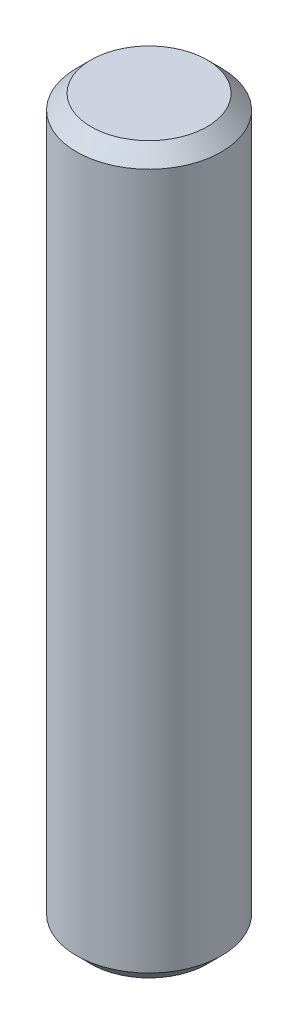
ISO-10303-21;
HEADER;
FILE_DESCRIPTION(('STEP AP214'),'2;1');
FILE_NAME('part.step','',(''),(''),'','','');
FILE_SCHEMA(('AUTOMOTIVE_DESIGN { 1 0 10303 214 1 1 1 1 }'));
ENDSEC;
DATA;
#1=APPLICATION_CONTEXT('core data for automotive mechanical design processes');
#2=APPLICATION_PROTOCOL_DEFINITION('international standard','automotive_design',2000,#1);
#3=PRODUCT_CONTEXT('',#1,'mechanical');
#4=PRODUCT('Part','Part','',(#3));
#5=PRODUCT_RELATED_PRODUCT_CATEGORY('part','',(#4));
#6=PRODUCT_DEFINITION_FORMATION('','',#4);
#7=PRODUCT_DEFINITION_CONTEXT('part definition',#1,'design');
#8=PRODUCT_DEFINITION('design','',#6,#7);
#9=PRODUCT_DEFINITION_SHAPE('','',#8);
#10=(LENGTH_UNIT() NAMED_UNIT(*) SI_UNIT(.MILLI.,.METRE.));
#11=(NAMED_UNIT(*) PLANE_ANGLE_UNIT() SI_UNIT($,.RADIAN.));
#12=(NAMED_UNIT(*) SI_UNIT($,.STERADIAN.) SOLID_ANGLE_UNIT());
#13=UNCERTAINTY_MEASURE_WITH_UNIT(LENGTH_MEASURE(1.E-05),#10,'distance_accuracy_value','');
#14=(GEOMETRIC_REPRESENTATION_CONTEXT(3) GLOBAL_UNCERTAINTY_ASSIGNED_CONTEXT((#13)) GLOBAL_UNIT_ASSIGNED_CONTEXT((#10,
#11,#12)) REPRESENTATION_CONTEXT('',''));
#15=CARTESIAN_POINT('',(0.,0.,0.));
#16=DIRECTION('',(0.,0.,1.));
#17=DIRECTION('',(1.,0.,0.));
#18=AXIS2_PLACEMENT_3D('',#15,#16,#17);
#19=CARTESIAN_POINT('',(0.,-20.,0.));
#20=DIRECTION('',(0.,1.,0.));
#21=DIRECTION('',(0.,0.,1.));
#22=AXIS2_PLACEMENT_3D('',#19,#20,#21);
#23=CONICAL_SURFACE('',#22,1.60000000000001,0.785398163397438);
#24=CARTESIAN_POINT('',(0.,-19.6,0.));
#25=DIRECTION('',(0.,-1.,0.));
#26=DIRECTION('',(0.,0.,-1.));
#27=AXIS2_PLACEMENT_3D('',#24,#25,#26);
#28=CIRCLE('',#27,2.);
#29=CARTESIAN_POINT('',(0.,-19.6,-2.));
#30=VERTEX_POINT('',#29);
#31=EDGE_CURVE('E44',#30,#30,#28,.T.);
#32=ORIENTED_EDGE('',*,*,#31,.T.);
#33=EDGE_LOOP('',(#32));
#34=FACE_BOUND('',#33,.T.);
#35=CARTESIAN_POINT('',(0.,-20.,0.));
#36=DIRECTION('',(0.,-1.,0.));
#37=DIRECTION('',(0.,0.,-1.));
#38=AXIS2_PLACEMENT_3D('',#35,#36,#37);
#39=CIRCLE('',#38,1.60000000000001);
#40=CARTESIAN_POINT('',(0.,-20.,-1.60000000000001));
#41=VERTEX_POINT('',#40);
#42=EDGE_CURVE('E10',#41,#41,#39,.T.);
#43=ORIENTED_EDGE('',*,*,#42,.F.);
#44=EDGE_LOOP('',(#43));
#45=FACE_BOUND('',#44,.T.);
#46=ADVANCED_FACE('F30',(#34,#45),#23,.T.);
#47=CARTESIAN_POINT('',(0.,-20.,0.));
#48=DIRECTION('',(0.,-1.,0.));
#49=DIRECTION('',(0.,0.,-1.));
#50=AXIS2_PLACEMENT_3D('',#47,#48,#49);
#51=PLANE('',#50);
#52=ORIENTED_EDGE('',*,*,#42,.T.);
#53=EDGE_LOOP('',(#52));
#54=FACE_BOUND('',#53,.T.);
#55=ADVANCED_FACE('F63',(#54),#51,.T.);
#56=CARTESIAN_POINT('',(0.,0.,0.));
#57=DIRECTION('',(0.,1.,0.));
#58=DIRECTION('',(0.,0.,1.));
#59=AXIS2_PLACEMENT_3D('',#56,#57,#58);
#60=PLANE('',#59);
#61=CARTESIAN_POINT('',(0.,0.,0.));
#62=DIRECTION('',(0.,-1.,0.));
#63=DIRECTION('',(0.,0.,-1.));
#64=AXIS2_PLACEMENT_3D('',#61,#62,#63);
#65=CIRCLE('',#64,1.60000000000001);
#66=CARTESIAN_POINT('',(0.,0.,-1.60000000000001));
#67=VERTEX_POINT('',#66);
#68=EDGE_CURVE('E36',#67,#67,#65,.T.);
#69=ORIENTED_EDGE('',*,*,#68,.F.);
#70=EDGE_LOOP('',(#69));
#71=FACE_BOUND('',#70,.T.);
#72=ADVANCED_FACE('F60',(#71),#60,.T.);
#73=CARTESIAN_POINT('',(0.,-0.399999999999994,0.));
#74=DIRECTION('',(0.,-1.,0.));
#75=DIRECTION('',(0.,0.,-1.));
#76=AXIS2_PLACEMENT_3D('',#73,#74,#75);
#77=CONICAL_SURFACE('',#76,2.00000000000001,0.78539816339745);
#78=ORIENTED_EDGE('',*,*,#68,.T.);
#79=EDGE_LOOP('',(#78));
#80=FACE_BOUND('',#79,.T.);
#81=CARTESIAN_POINT('',(0.,-0.399999999999994,0.));
#82=DIRECTION('',(0.,-1.,0.));
#83=DIRECTION('',(0.,0.,-1.));
#84=AXIS2_PLACEMENT_3D('',#81,#82,#83);
#85=CIRCLE('',#84,2.00000000000001);
#86=CARTESIAN_POINT('',(0.,-0.399999999999994,-2.00000000000001));
#87=VERTEX_POINT('',#86);
#88=EDGE_CURVE('E40',#87,#87,#85,.T.);
#89=ORIENTED_EDGE('',*,*,#88,.F.);
#90=EDGE_LOOP('',(#89));
#91=FACE_BOUND('',#90,.T.);
#92=ADVANCED_FACE('F54',(#80,#91),#77,.T.);
#93=CARTESIAN_POINT('',(0.,0.,0.));
#94=DIRECTION('',(0.,-1.,0.));
#95=DIRECTION('',(0.,0.,-1.));
#96=AXIS2_PLACEMENT_3D('',#93,#94,#95);
#97=CYLINDRICAL_SURFACE('',#96,2.);
#98=ORIENTED_EDGE('',*,*,#88,.T.);
#99=EDGE_LOOP('',(#98));
#100=FACE_BOUND('',#99,.T.);
#101=ORIENTED_EDGE('',*,*,#31,.F.);
#102=EDGE_LOOP('',(#101));
#103=FACE_BOUND('',#102,.T.);
#104=ADVANCED_FACE('F52',(#100,#103),#97,.T.);
#105=CLOSED_SHELL('',(#46,#55,#72,#92,#104));
#106=MANIFOLD_SOLID_BREP('B2',#105);
#107=ADVANCED_BREP_SHAPE_REPRESENTATION('',(#18,#106),#14);
#108=SHAPE_DEFINITION_REPRESENTATION(#9,#107);
ENDSEC;
END-ISO-10303-21;
